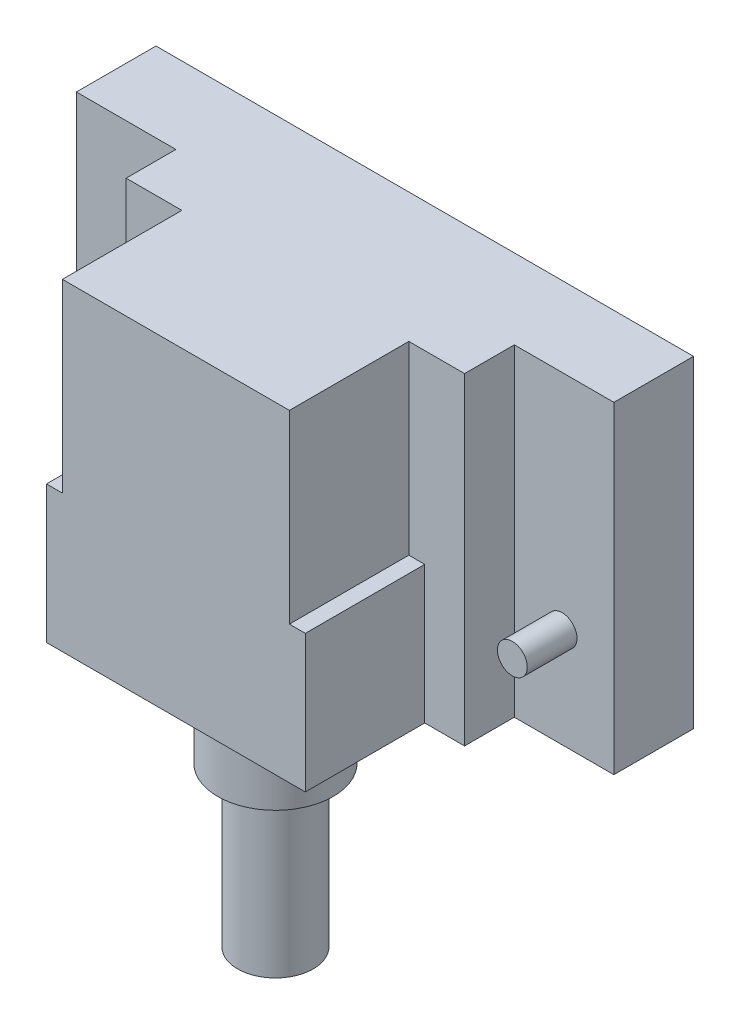
ISO-10303-21;
HEADER;
FILE_DESCRIPTION(('STEP AP214'),'2;1');
FILE_NAME('part.step','',(''),(''),'','','');
FILE_SCHEMA(('AUTOMOTIVE_DESIGN { 1 0 10303 214 1 1 1 1 }'));
ENDSEC;
DATA;
#1=APPLICATION_CONTEXT('core data for automotive mechanical design processes');
#2=APPLICATION_PROTOCOL_DEFINITION('international standard','automotive_design',2000,#1);
#3=PRODUCT_CONTEXT('',#1,'mechanical');
#4=PRODUCT('Part','Part','',(#3));
#5=PRODUCT_RELATED_PRODUCT_CATEGORY('part','',(#4));
#6=PRODUCT_DEFINITION_FORMATION('','',#4);
#7=PRODUCT_DEFINITION_CONTEXT('part definition',#1,'design');
#8=PRODUCT_DEFINITION('design','',#6,#7);
#9=PRODUCT_DEFINITION_SHAPE('','',#8);
#10=(LENGTH_UNIT() NAMED_UNIT(*) SI_UNIT(.MILLI.,.METRE.));
#11=(NAMED_UNIT(*) PLANE_ANGLE_UNIT() SI_UNIT($,.RADIAN.));
#12=(NAMED_UNIT(*) SI_UNIT($,.STERADIAN.) SOLID_ANGLE_UNIT());
#13=UNCERTAINTY_MEASURE_WITH_UNIT(LENGTH_MEASURE(1.E-05),#10,'distance_accuracy_value','');
#14=(GEOMETRIC_REPRESENTATION_CONTEXT(3) GLOBAL_UNCERTAINTY_ASSIGNED_CONTEXT((#13)) GLOBAL_UNIT_ASSIGNED_CONTEXT((#10,
#11,#12)) REPRESENTATION_CONTEXT('',''));
#15=CARTESIAN_POINT('',(0.,0.,0.));
#16=DIRECTION('',(0.,0.,1.));
#17=DIRECTION('',(1.,0.,0.));
#18=AXIS2_PLACEMENT_3D('',#15,#16,#17);
#19=CARTESIAN_POINT('',(-8.50000000000001,-8.1,-6.));
#20=DIRECTION('',(-1.,0.,0.));
#21=DIRECTION('',(0.,0.,1.));
#22=AXIS2_PLACEMENT_3D('',#19,#20,#21);
#23=PLANE('',#22);
#24=DIRECTION('',(0.,0.,-1.));
#25=VECTOR('',#24,1.);
#26=CARTESIAN_POINT('',(-8.50000000000001,8.1,-6.));
#27=LINE('',#26,#25);
#28=CARTESIAN_POINT('',(-8.50000000000001,8.1,-6.));
#29=VERTEX_POINT('',#28);
#30=CARTESIAN_POINT('',(-8.50000000000001,8.1,-8.5));
#31=VERTEX_POINT('',#30);
#32=EDGE_CURVE('E251',#29,#31,#27,.T.);
#33=ORIENTED_EDGE('',*,*,#32,.T.);
#34=DIRECTION('',(0.,-1.,0.));
#35=VECTOR('',#34,1.);
#36=CARTESIAN_POINT('',(-8.50000000000001,-8.1,-8.5));
#37=LINE('',#36,#35);
#38=CARTESIAN_POINT('',(-8.50000000000001,-8.1,-8.5));
#39=VERTEX_POINT('',#38);
#40=EDGE_CURVE('E213',#31,#39,#37,.T.);
#41=ORIENTED_EDGE('',*,*,#40,.T.);
#42=DIRECTION('',(0.,0.,-1.));
#43=VECTOR('',#42,1.);
#44=CARTESIAN_POINT('',(-8.50000000000001,-8.1,-6.));
#45=LINE('',#44,#43);
#46=CARTESIAN_POINT('',(-8.50000000000001,-8.1,-6.));
#47=VERTEX_POINT('',#46);
#48=EDGE_CURVE('E254',#47,#39,#45,.T.);
#49=ORIENTED_EDGE('',*,*,#48,.F.);
#50=DIRECTION('',(0.,1.,0.));
#51=VECTOR('',#50,1.);
#52=CARTESIAN_POINT('',(-8.50000000000001,-8.1,-6.));
#53=LINE('',#52,#51);
#54=EDGE_CURVE('E261',#47,#29,#53,.T.);
#55=ORIENTED_EDGE('',*,*,#54,.T.);
#56=EDGE_LOOP('',(#33,#41,#49,#55));
#57=FACE_BOUND('',#56,.T.);
#58=ADVANCED_FACE('F38',(#57),#23,.T.);
#59=CARTESIAN_POINT('',(8.5,-8.1,-6.));
#60=DIRECTION('',(1.,0.,0.));
#61=DIRECTION('',(0.,0.,-1.));
#62=AXIS2_PLACEMENT_3D('',#59,#60,#61);
#63=PLANE('',#62);
#64=DIRECTION('',(0.,0.,-1.));
#65=VECTOR('',#64,1.);
#66=CARTESIAN_POINT('',(8.5,-8.1,-6.));
#67=LINE('',#66,#65);
#68=CARTESIAN_POINT('',(8.5,-8.1,-6.));
#69=VERTEX_POINT('',#68);
#70=CARTESIAN_POINT('',(8.5,-8.1,-8.5));
#71=VERTEX_POINT('',#70);
#72=EDGE_CURVE('E276',#69,#71,#67,.T.);
#73=ORIENTED_EDGE('',*,*,#72,.T.);
#74=DIRECTION('',(0.,1.,0.));
#75=VECTOR('',#74,1.);
#76=CARTESIAN_POINT('',(8.5,-8.1,-8.5));
#77=LINE('',#76,#75);
#78=CARTESIAN_POINT('',(8.5,8.1,-8.5));
#79=VERTEX_POINT('',#78);
#80=EDGE_CURVE('E221',#71,#79,#77,.T.);
#81=ORIENTED_EDGE('',*,*,#80,.T.);
#82=DIRECTION('',(0.,0.,-1.));
#83=VECTOR('',#82,1.);
#84=CARTESIAN_POINT('',(8.5,8.1,-6.));
#85=LINE('',#84,#83);
#86=CARTESIAN_POINT('',(8.5,8.1,-6.));
#87=VERTEX_POINT('',#86);
#88=EDGE_CURVE('E275',#87,#79,#85,.T.);
#89=ORIENTED_EDGE('',*,*,#88,.F.);
#90=DIRECTION('',(0.,-1.,0.));
#91=VECTOR('',#90,1.);
#92=CARTESIAN_POINT('',(8.5,-8.1,-6.));
#93=LINE('',#92,#91);
#94=EDGE_CURVE('E157',#87,#69,#93,.T.);
#95=ORIENTED_EDGE('',*,*,#94,.T.);
#96=EDGE_LOOP('',(#73,#81,#89,#95));
#97=FACE_BOUND('',#96,.T.);
#98=ADVANCED_FACE('F335',(#97),#63,.T.);
#99=CARTESIAN_POINT('',(-6.50000000000001,-8.1,-12.5));
#100=DIRECTION('',(-1.,0.,0.));
#101=DIRECTION('',(0.,0.,1.));
#102=AXIS2_PLACEMENT_3D('',#99,#100,#101);
#103=PLANE('',#102);
#104=DIRECTION('',(0.,0.,1.));
#105=VECTOR('',#104,1.);
#106=CARTESIAN_POINT('',(-6.50000000000001,-1.2,-15.3343451832466));
#107=LINE('',#106,#105);
#108=CARTESIAN_POINT('',(-6.50000000000001,-1.2,-6.));
#109=VERTEX_POINT('',#108);
#110=CARTESIAN_POINT('',(-6.50000000000001,-1.2,0.));
#111=VERTEX_POINT('',#110);
#112=EDGE_CURVE('E183',#109,#111,#107,.T.);
#113=ORIENTED_EDGE('',*,*,#112,.F.);
#114=DIRECTION('',(0.,-1.,0.));
#115=VECTOR('',#114,1.);
#116=CARTESIAN_POINT('',(-6.50000000000001,-8.1,-6.));
#117=LINE('',#116,#115);
#118=CARTESIAN_POINT('',(-6.50000000000001,-8.1,-6.));
#119=VERTEX_POINT('',#118);
#120=EDGE_CURVE('E267',#109,#119,#117,.T.);
#121=ORIENTED_EDGE('',*,*,#120,.T.);
#122=DIRECTION('',(0.,0.,1.));
#123=VECTOR('',#122,1.);
#124=CARTESIAN_POINT('',(-6.50000000000001,-8.1,-12.5));
#125=LINE('',#124,#123);
#126=CARTESIAN_POINT('',(-6.50000000000001,-8.1,0.));
#127=VERTEX_POINT('',#126);
#128=EDGE_CURVE('E286',#119,#127,#125,.T.);
#129=ORIENTED_EDGE('',*,*,#128,.T.);
#130=DIRECTION('',(0.,-1.,0.));
#131=VECTOR('',#130,1.);
#132=CARTESIAN_POINT('',(-6.50000000000001,-8.1,0.));
#133=LINE('',#132,#131);
#134=EDGE_CURVE('E290',#111,#127,#133,.T.);
#135=ORIENTED_EDGE('',*,*,#134,.F.);
#136=EDGE_LOOP('',(#113,#121,#129,#135));
#137=FACE_BOUND('',#136,.T.);
#138=ADVANCED_FACE('F300',(#137),#103,.T.);
#139=CARTESIAN_POINT('',(6.5,-8.1,-12.5));
#140=DIRECTION('',(1.,0.,0.));
#141=DIRECTION('',(0.,0.,-1.));
#142=AXIS2_PLACEMENT_3D('',#139,#140,#141);
#143=PLANE('',#142);
#144=DIRECTION('',(0.,0.,1.));
#145=VECTOR('',#144,1.);
#146=CARTESIAN_POINT('',(6.5,-1.19999999999999,-15.3343451832466));
#147=LINE('',#146,#145);
#148=CARTESIAN_POINT('',(6.5,-1.19999999999999,-6.));
#149=VERTEX_POINT('',#148);
#150=CARTESIAN_POINT('',(6.5,-1.19999999999999,0.));
#151=VERTEX_POINT('',#150);
#152=EDGE_CURVE('E208',#149,#151,#147,.T.);
#153=ORIENTED_EDGE('',*,*,#152,.T.);
#154=DIRECTION('',(0.,1.,0.));
#155=VECTOR('',#154,1.);
#156=CARTESIAN_POINT('',(6.5,-8.1,0.));
#157=LINE('',#156,#155);
#158=CARTESIAN_POINT('',(6.5,-8.1,0.));
#159=VERTEX_POINT('',#158);
#160=EDGE_CURVE('E279',#159,#151,#157,.T.);
#161=ORIENTED_EDGE('',*,*,#160,.F.);
#162=DIRECTION('',(0.,0.,1.));
#163=VECTOR('',#162,1.);
#164=CARTESIAN_POINT('',(6.5,-8.1,-12.5));
#165=LINE('',#164,#163);
#166=CARTESIAN_POINT('',(6.5,-8.1,-6.));
#167=VERTEX_POINT('',#166);
#168=EDGE_CURVE('E247',#167,#159,#165,.T.);
#169=ORIENTED_EDGE('',*,*,#168,.F.);
#170=DIRECTION('',(0.,1.,0.));
#171=VECTOR('',#170,1.);
#172=CARTESIAN_POINT('',(6.5,-8.1,-6.));
#173=LINE('',#172,#171);
#174=EDGE_CURVE('E161',#167,#149,#173,.T.);
#175=ORIENTED_EDGE('',*,*,#174,.T.);
#176=EDGE_LOOP('',(#153,#161,#169,#175));
#177=FACE_BOUND('',#176,.T.);
#178=ADVANCED_FACE('F40',(#177),#143,.T.);
#179=CARTESIAN_POINT('',(-6.50000000000001,-8.1,-12.5));
#180=DIRECTION('',(0.,-1.,0.));
#181=DIRECTION('',(0.,0.,-1.));
#182=AXIS2_PLACEMENT_3D('',#179,#180,#181);
#183=PLANE('',#182);
#184=CARTESIAN_POINT('',(2.,-8.1,-3.));
#185=DIRECTION('',(0.,-1.,0.));
#186=DIRECTION('',(0.,0.,-1.));
#187=AXIS2_PLACEMENT_3D('',#184,#185,#186);
#188=CIRCLE('',#187,2.9);
#189=CARTESIAN_POINT('',(2.,-8.1,-5.9));
#190=VERTEX_POINT('',#189);
#191=EDGE_CURVE('E244',#190,#190,#188,.T.);
#192=ORIENTED_EDGE('',*,*,#191,.F.);
#193=EDGE_LOOP('',(#192));
#194=FACE_BOUND('',#193,.T.);
#195=DIRECTION('',(1.,0.,0.));
#196=VECTOR('',#195,1.);
#197=CARTESIAN_POINT('',(-6.50000000000001,-8.1,0.));
#198=LINE('',#197,#196);
#199=EDGE_CURVE('E284',#127,#159,#198,.T.);
#200=ORIENTED_EDGE('',*,*,#199,.F.);
#201=ORIENTED_EDGE('',*,*,#128,.F.);
#202=DIRECTION('',(-1.,0.,0.));
#203=VECTOR('',#202,1.);
#204=CARTESIAN_POINT('',(-6.50000000000001,-8.1,-6.));
#205=LINE('',#204,#203);
#206=EDGE_CURVE('E264',#119,#47,#205,.T.);
#207=ORIENTED_EDGE('',*,*,#206,.T.);
#208=ORIENTED_EDGE('',*,*,#48,.T.);
#209=DIRECTION('',(-1.,0.,0.));
#210=VECTOR('',#209,1.);
#211=CARTESIAN_POINT('',(-8.50000000000001,-8.1,-8.5));
#212=LINE('',#211,#210);
#213=CARTESIAN_POINT('',(-13.5,-8.1,-8.5));
#214=VERTEX_POINT('',#213);
#215=EDGE_CURVE('E61',#39,#214,#212,.T.);
#216=ORIENTED_EDGE('',*,*,#215,.T.);
#217=DIRECTION('',(0.,0.,-1.));
#218=VECTOR('',#217,1.);
#219=CARTESIAN_POINT('',(-13.5,-8.1,-8.5));
#220=LINE('',#219,#218);
#221=CARTESIAN_POINT('',(-13.5,-8.1,-12.5));
#222=VERTEX_POINT('',#221);
#223=EDGE_CURVE('E201',#214,#222,#220,.T.);
#224=ORIENTED_EDGE('',*,*,#223,.T.);
#225=DIRECTION('',(1.,0.,0.));
#226=VECTOR('',#225,1.);
#227=CARTESIAN_POINT('',(-6.50000000000001,-8.1,-12.5));
#228=LINE('',#227,#226);
#229=CARTESIAN_POINT('',(13.5,-8.1,-12.5));
#230=VERTEX_POINT('',#229);
#231=EDGE_CURVE('E283',#222,#230,#228,.T.);
#232=ORIENTED_EDGE('',*,*,#231,.T.);
#233=DIRECTION('',(0.,0.,-1.));
#234=VECTOR('',#233,1.);
#235=CARTESIAN_POINT('',(13.5,-8.1,-8.5));
#236=LINE('',#235,#234);
#237=CARTESIAN_POINT('',(13.5,-8.1,-8.5));
#238=VERTEX_POINT('',#237);
#239=EDGE_CURVE('E236',#238,#230,#236,.T.);
#240=ORIENTED_EDGE('',*,*,#239,.F.);
#241=DIRECTION('',(-1.,0.,0.));
#242=VECTOR('',#241,1.);
#243=CARTESIAN_POINT('',(8.5,-8.1,-8.5));
#244=LINE('',#243,#242);
#245=EDGE_CURVE('E230',#238,#71,#244,.T.);
#246=ORIENTED_EDGE('',*,*,#245,.T.);
#247=ORIENTED_EDGE('',*,*,#72,.F.);
#248=DIRECTION('',(-1.,0.,0.));
#249=VECTOR('',#248,1.);
#250=CARTESIAN_POINT('',(6.5,-8.1,-6.));
#251=LINE('',#250,#249);
#252=EDGE_CURVE('E272',#69,#167,#251,.T.);
#253=ORIENTED_EDGE('',*,*,#252,.T.);
#254=ORIENTED_EDGE('',*,*,#168,.T.);
#255=EDGE_LOOP('',(#200,#201,#207,#208,#216,#224,#232,#240,#246,#247,#253,#254));
#256=FACE_BOUND('',#255,.T.);
#257=ADVANCED_FACE('F304',(#194,#256),#183,.T.);
#258=CARTESIAN_POINT('',(-6.50000000000001,8.1,-12.5));
#259=DIRECTION('',(0.,1.,0.));
#260=DIRECTION('',(0.,0.,1.));
#261=AXIS2_PLACEMENT_3D('',#258,#259,#260);
#262=PLANE('',#261);
#263=DIRECTION('',(0.,0.,1.));
#264=VECTOR('',#263,1.);
#265=CARTESIAN_POINT('',(5.7,8.1,-15.3343451832466));
#266=LINE('',#265,#264);
#267=CARTESIAN_POINT('',(5.7,8.1,-6.));
#268=VERTEX_POINT('',#267);
#269=CARTESIAN_POINT('',(5.7,8.1,0.));
#270=VERTEX_POINT('',#269);
#271=EDGE_CURVE('E167',#268,#270,#266,.T.);
#272=ORIENTED_EDGE('',*,*,#271,.F.);
#273=DIRECTION('',(1.,0.,0.));
#274=VECTOR('',#273,1.);
#275=CARTESIAN_POINT('',(6.5,8.1,-6.));
#276=LINE('',#275,#274);
#277=EDGE_CURVE('E151',#268,#87,#276,.T.);
#278=ORIENTED_EDGE('',*,*,#277,.T.);
#279=ORIENTED_EDGE('',*,*,#88,.T.);
#280=DIRECTION('',(1.,0.,0.));
#281=VECTOR('',#280,1.);
#282=CARTESIAN_POINT('',(8.5,8.1,-8.5));
#283=LINE('',#282,#281);
#284=CARTESIAN_POINT('',(13.5,8.1,-8.5));
#285=VERTEX_POINT('',#284);
#286=EDGE_CURVE('E224',#79,#285,#283,.T.);
#287=ORIENTED_EDGE('',*,*,#286,.T.);
#288=DIRECTION('',(0.,0.,-1.));
#289=VECTOR('',#288,1.);
#290=CARTESIAN_POINT('',(13.5,8.1,-8.5));
#291=LINE('',#290,#289);
#292=CARTESIAN_POINT('',(13.5,8.1,-12.5));
#293=VERTEX_POINT('',#292);
#294=EDGE_CURVE('E233',#285,#293,#291,.T.);
#295=ORIENTED_EDGE('',*,*,#294,.T.);
#296=DIRECTION('',(-1.,0.,0.));
#297=VECTOR('',#296,1.);
#298=CARTESIAN_POINT('',(-6.50000000000001,8.1,-12.5));
#299=LINE('',#298,#297);
#300=CARTESIAN_POINT('',(-13.5,8.1,-12.5));
#301=VERTEX_POINT('',#300);
#302=EDGE_CURVE('E281',#293,#301,#299,.T.);
#303=ORIENTED_EDGE('',*,*,#302,.T.);
#304=DIRECTION('',(0.,0.,-1.));
#305=VECTOR('',#304,1.);
#306=CARTESIAN_POINT('',(-13.5,8.1,-8.5));
#307=LINE('',#306,#305);
#308=CARTESIAN_POINT('',(-13.5,8.1,-8.5));
#309=VERTEX_POINT('',#308);
#310=EDGE_CURVE('E205',#309,#301,#307,.T.);
#311=ORIENTED_EDGE('',*,*,#310,.F.);
#312=DIRECTION('',(1.,0.,0.));
#313=VECTOR('',#312,1.);
#314=CARTESIAN_POINT('',(-8.50000000000001,8.1,-8.5));
#315=LINE('',#314,#313);
#316=EDGE_CURVE('E204',#309,#31,#315,.T.);
#317=ORIENTED_EDGE('',*,*,#316,.T.);
#318=ORIENTED_EDGE('',*,*,#32,.F.);
#319=DIRECTION('',(1.,0.,0.));
#320=VECTOR('',#319,1.);
#321=CARTESIAN_POINT('',(-6.50000000000001,8.1,-6.));
#322=LINE('',#321,#320);
#323=CARTESIAN_POINT('',(-5.70000000000001,8.1,-6.));
#324=VERTEX_POINT('',#323);
#325=EDGE_CURVE('E257',#29,#324,#322,.T.);
#326=ORIENTED_EDGE('',*,*,#325,.T.);
#327=DIRECTION('',(0.,0.,1.));
#328=VECTOR('',#327,1.);
#329=CARTESIAN_POINT('',(-5.70000000000001,8.1,-15.3343451832466));
#330=LINE('',#329,#328);
#331=CARTESIAN_POINT('',(-5.70000000000001,8.1,0.));
#332=VERTEX_POINT('',#331);
#333=EDGE_CURVE('E185',#324,#332,#330,.T.);
#334=ORIENTED_EDGE('',*,*,#333,.T.);
#335=DIRECTION('',(-1.,0.,0.));
#336=VECTOR('',#335,1.);
#337=CARTESIAN_POINT('',(-6.50000000000001,8.1,0.));
#338=LINE('',#337,#336);
#339=EDGE_CURVE('E175',#270,#332,#338,.T.);
#340=ORIENTED_EDGE('',*,*,#339,.F.);
#341=EDGE_LOOP('',(#272,#278,#279,#287,#295,#303,#311,#317,#318,#326,#334,#340));
#342=FACE_BOUND('',#341,.T.);
#343=ADVANCED_FACE('F172',(#342),#262,.T.);
#344=CARTESIAN_POINT('',(0.,0.,-12.5));
#345=DIRECTION('',(0.,0.,-1.));
#346=DIRECTION('',(-1.,0.,0.));
#347=AXIS2_PLACEMENT_3D('',#344,#345,#346);
#348=PLANE('',#347);
#349=ORIENTED_EDGE('',*,*,#302,.F.);
#350=DIRECTION('',(0.,-1.,0.));
#351=VECTOR('',#350,1.);
#352=CARTESIAN_POINT('',(13.5,-8.1,-12.5));
#353=LINE('',#352,#351);
#354=EDGE_CURVE('E212',#293,#230,#353,.T.);
#355=ORIENTED_EDGE('',*,*,#354,.T.);
#356=ORIENTED_EDGE('',*,*,#231,.F.);
#357=DIRECTION('',(0.,1.,0.));
#358=VECTOR('',#357,1.);
#359=CARTESIAN_POINT('',(-13.5,-8.1,-12.5));
#360=LINE('',#359,#358);
#361=EDGE_CURVE('E209',#222,#301,#360,.T.);
#362=ORIENTED_EDGE('',*,*,#361,.T.);
#363=EDGE_LOOP('',(#349,#355,#356,#362));
#364=FACE_BOUND('',#363,.T.);
#365=ADVANCED_FACE('F331',(#364),#348,.T.);
#366=CARTESIAN_POINT('',(0.,0.,0.));
#367=DIRECTION('',(0.,0.,-1.));
#368=DIRECTION('',(-1.,0.,0.));
#369=AXIS2_PLACEMENT_3D('',#366,#367,#368);
#370=PLANE('',#369);
#371=DIRECTION('',(1.,0.,0.));
#372=VECTOR('',#371,1.);
#373=CARTESIAN_POINT('',(6.5,-1.19999999999999,0.));
#374=LINE('',#373,#372);
#375=CARTESIAN_POINT('',(5.7,-1.2,0.));
#376=VERTEX_POINT('',#375);
#377=EDGE_CURVE('E176',#376,#151,#374,.T.);
#378=ORIENTED_EDGE('',*,*,#377,.F.);
#379=DIRECTION('',(0.,-1.,0.));
#380=VECTOR('',#379,1.);
#381=CARTESIAN_POINT('',(5.7,8.1,0.));
#382=LINE('',#381,#380);
#383=EDGE_CURVE('E178',#270,#376,#382,.T.);
#384=ORIENTED_EDGE('',*,*,#383,.F.);
#385=ORIENTED_EDGE('',*,*,#339,.T.);
#386=DIRECTION('',(0.,1.,0.));
#387=VECTOR('',#386,1.);
#388=CARTESIAN_POINT('',(-5.70000000000001,8.1,0.));
#389=LINE('',#388,#387);
#390=CARTESIAN_POINT('',(-5.70000000000001,-1.2,0.));
#391=VERTEX_POINT('',#390);
#392=EDGE_CURVE('E196',#391,#332,#389,.T.);
#393=ORIENTED_EDGE('',*,*,#392,.F.);
#394=DIRECTION('',(1.,0.,0.));
#395=VECTOR('',#394,1.);
#396=CARTESIAN_POINT('',(-6.50000000000001,-1.2,0.));
#397=LINE('',#396,#395);
#398=EDGE_CURVE('E197',#111,#391,#397,.T.);
#399=ORIENTED_EDGE('',*,*,#398,.F.);
#400=ORIENTED_EDGE('',*,*,#134,.T.);
#401=ORIENTED_EDGE('',*,*,#199,.T.);
#402=ORIENTED_EDGE('',*,*,#160,.T.);
#403=EDGE_LOOP('',(#378,#384,#385,#393,#399,#400,#401,#402));
#404=FACE_BOUND('',#403,.T.);
#405=ADVANCED_FACE('F309',(#404),#370,.F.);
#406=CARTESIAN_POINT('',(0.,0.,-6.));
#407=DIRECTION('',(0.,0.,-1.));
#408=DIRECTION('',(-1.,0.,0.));
#409=AXIS2_PLACEMENT_3D('',#406,#407,#408);
#410=PLANE('',#409);
#411=ORIENTED_EDGE('',*,*,#174,.F.);
#412=ORIENTED_EDGE('',*,*,#252,.F.);
#413=ORIENTED_EDGE('',*,*,#94,.F.);
#414=ORIENTED_EDGE('',*,*,#277,.F.);
#415=DIRECTION('',(0.,-1.,0.));
#416=VECTOR('',#415,1.);
#417=CARTESIAN_POINT('',(5.7,8.1,-6.));
#418=LINE('',#417,#416);
#419=CARTESIAN_POINT('',(5.7,-1.19999999999999,-6.));
#420=VERTEX_POINT('',#419);
#421=EDGE_CURVE('E154',#268,#420,#418,.T.);
#422=ORIENTED_EDGE('',*,*,#421,.T.);
#423=DIRECTION('',(1.,0.,0.));
#424=VECTOR('',#423,1.);
#425=CARTESIAN_POINT('',(6.5,-1.19999999999999,-6.));
#426=LINE('',#425,#424);
#427=EDGE_CURVE('E53',#420,#149,#426,.T.);
#428=ORIENTED_EDGE('',*,*,#427,.T.);
#429=EDGE_LOOP('',(#411,#412,#413,#414,#422,#428));
#430=FACE_BOUND('',#429,.T.);
#431=ADVANCED_FACE('F153',(#430),#410,.F.);
#432=CARTESIAN_POINT('',(0.,0.,-6.));
#433=DIRECTION('',(0.,0.,1.));
#434=DIRECTION('',(1.,0.,0.));
#435=AXIS2_PLACEMENT_3D('',#432,#433,#434);
#436=PLANE('',#435);
#437=ORIENTED_EDGE('',*,*,#120,.F.);
#438=DIRECTION('',(1.,0.,0.));
#439=VECTOR('',#438,1.);
#440=CARTESIAN_POINT('',(-6.50000000000001,-1.2,-6.));
#441=LINE('',#440,#439);
#442=CARTESIAN_POINT('',(-5.70000000000001,-1.2,-6.));
#443=VERTEX_POINT('',#442);
#444=EDGE_CURVE('E189',#109,#443,#441,.T.);
#445=ORIENTED_EDGE('',*,*,#444,.T.);
#446=DIRECTION('',(0.,1.,0.));
#447=VECTOR('',#446,1.);
#448=CARTESIAN_POINT('',(-5.70000000000001,8.1,-6.));
#449=LINE('',#448,#447);
#450=EDGE_CURVE('E190',#443,#324,#449,.T.);
#451=ORIENTED_EDGE('',*,*,#450,.T.);
#452=ORIENTED_EDGE('',*,*,#325,.F.);
#453=ORIENTED_EDGE('',*,*,#54,.F.);
#454=ORIENTED_EDGE('',*,*,#206,.F.);
#455=EDGE_LOOP('',(#437,#445,#451,#452,#453,#454));
#456=FACE_BOUND('',#455,.T.);
#457=ADVANCED_FACE('F316',(#456),#436,.T.);
#458=CARTESIAN_POINT('',(2.,-10.6,-3.));
#459=DIRECTION('',(0.,1.,0.));
#460=DIRECTION('',(0.,0.,1.));
#461=AXIS2_PLACEMENT_3D('',#458,#459,#460);
#462=CYLINDRICAL_SURFACE('',#461,2.9);
#463=CARTESIAN_POINT('',(2.,-10.6,-3.));
#464=DIRECTION('',(0.,-1.,0.));
#465=DIRECTION('',(0.,0.,-1.));
#466=AXIS2_PLACEMENT_3D('',#463,#464,#465);
#467=CIRCLE('',#466,2.9);
#468=CARTESIAN_POINT('',(2.,-10.6,-5.9));
#469=VERTEX_POINT('',#468);
#470=EDGE_CURVE('E248',#469,#469,#467,.T.);
#471=ORIENTED_EDGE('',*,*,#470,.F.);
#472=EDGE_LOOP('',(#471));
#473=FACE_BOUND('',#472,.T.);
#474=ORIENTED_EDGE('',*,*,#191,.T.);
#475=EDGE_LOOP('',(#474));
#476=FACE_BOUND('',#475,.T.);
#477=ADVANCED_FACE('F375',(#473,#476),#462,.T.);
#478=CARTESIAN_POINT('',(2.,-10.6,-3.));
#479=DIRECTION('',(0.,-1.,0.));
#480=DIRECTION('',(0.,0.,-1.));
#481=AXIS2_PLACEMENT_3D('',#478,#479,#480);
#482=PLANE('',#481);
#483=CARTESIAN_POINT('',(2.,-10.6,-3.));
#484=DIRECTION('',(0.,-1.,0.));
#485=DIRECTION('',(0.,0.,-1.));
#486=AXIS2_PLACEMENT_3D('',#483,#484,#485);
#487=CIRCLE('',#486,1.9);
#488=CARTESIAN_POINT('',(2.,-10.6,-4.9));
#489=VERTEX_POINT('',#488);
#490=EDGE_CURVE('E46',#489,#489,#487,.T.);
#491=ORIENTED_EDGE('',*,*,#490,.F.);
#492=EDGE_LOOP('',(#491));
#493=FACE_BOUND('',#492,.T.);
#494=ORIENTED_EDGE('',*,*,#470,.T.);
#495=EDGE_LOOP('',(#494));
#496=FACE_BOUND('',#495,.T.);
#497=ADVANCED_FACE('F420',(#493,#496),#482,.T.);
#498=CARTESIAN_POINT('',(2.,-18.6,-3.));
#499=DIRECTION('',(0.,1.,0.));
#500=DIRECTION('',(0.,0.,1.));
#501=AXIS2_PLACEMENT_3D('',#498,#499,#500);
#502=CYLINDRICAL_SURFACE('',#501,1.9);
#503=CARTESIAN_POINT('',(2.,-18.6,-3.));
#504=DIRECTION('',(0.,-1.,0.));
#505=DIRECTION('',(0.,0.,-1.));
#506=AXIS2_PLACEMENT_3D('',#503,#504,#505);
#507=CIRCLE('',#506,1.9);
#508=CARTESIAN_POINT('',(2.,-18.6,-4.9));
#509=VERTEX_POINT('',#508);
#510=EDGE_CURVE('E239',#509,#509,#507,.T.);
#511=ORIENTED_EDGE('',*,*,#510,.F.);
#512=EDGE_LOOP('',(#511));
#513=FACE_BOUND('',#512,.T.);
#514=ORIENTED_EDGE('',*,*,#490,.T.);
#515=EDGE_LOOP('',(#514));
#516=FACE_BOUND('',#515,.T.);
#517=ADVANCED_FACE('F427',(#513,#516),#502,.T.);
#518=CARTESIAN_POINT('',(2.,-18.6,-3.));
#519=DIRECTION('',(0.,-1.,0.));
#520=DIRECTION('',(0.,0.,-1.));
#521=AXIS2_PLACEMENT_3D('',#518,#519,#520);
#522=PLANE('',#521);
#523=ORIENTED_EDGE('',*,*,#510,.T.);
#524=EDGE_LOOP('',(#523));
#525=FACE_BOUND('',#524,.T.);
#526=ADVANCED_FACE('F434',(#525),#522,.T.);
#527=CARTESIAN_POINT('',(13.5,-8.1,-8.5));
#528=DIRECTION('',(1.,0.,0.));
#529=DIRECTION('',(0.,0.,-1.));
#530=AXIS2_PLACEMENT_3D('',#527,#528,#529);
#531=PLANE('',#530);
#532=ORIENTED_EDGE('',*,*,#354,.F.);
#533=ORIENTED_EDGE('',*,*,#294,.F.);
#534=DIRECTION('',(0.,-1.,0.));
#535=VECTOR('',#534,1.);
#536=CARTESIAN_POINT('',(13.5,-8.1,-8.5));
#537=LINE('',#536,#535);
#538=EDGE_CURVE('E227',#285,#238,#537,.T.);
#539=ORIENTED_EDGE('',*,*,#538,.T.);
#540=ORIENTED_EDGE('',*,*,#239,.T.);
#541=EDGE_LOOP('',(#532,#533,#539,#540));
#542=FACE_BOUND('',#541,.T.);
#543=ADVANCED_FACE('F328',(#542),#531,.T.);
#544=CARTESIAN_POINT('',(0.,0.,-8.5));
#545=DIRECTION('',(0.,0.,-1.));
#546=DIRECTION('',(-1.,0.,0.));
#547=AXIS2_PLACEMENT_3D('',#544,#545,#546);
#548=PLANE('',#547);
#549=CARTESIAN_POINT('',(10.9,-3.1,-8.5));
#550=DIRECTION('',(0.,0.,-1.));
#551=DIRECTION('',(-1.,0.,0.));
#552=AXIS2_PLACEMENT_3D('',#549,#550,#551);
#553=CIRCLE('',#552,0.75);
#554=CARTESIAN_POINT('',(10.15,-3.1,-8.5));
#555=VERTEX_POINT('',#554);
#556=EDGE_CURVE('E11',#555,#555,#553,.F.);
#557=ORIENTED_EDGE('',*,*,#556,.F.);
#558=EDGE_LOOP('',(#557));
#559=FACE_BOUND('',#558,.T.);
#560=ORIENTED_EDGE('',*,*,#80,.F.);
#561=ORIENTED_EDGE('',*,*,#245,.F.);
#562=ORIENTED_EDGE('',*,*,#538,.F.);
#563=ORIENTED_EDGE('',*,*,#286,.F.);
#564=EDGE_LOOP('',(#560,#561,#562,#563));
#565=FACE_BOUND('',#564,.T.);
#566=ADVANCED_FACE('F333',(#559,#565),#548,.F.);
#567=CARTESIAN_POINT('',(-13.5,-8.1,-8.5));
#568=DIRECTION('',(-1.,0.,0.));
#569=DIRECTION('',(0.,0.,1.));
#570=AXIS2_PLACEMENT_3D('',#567,#568,#569);
#571=PLANE('',#570);
#572=ORIENTED_EDGE('',*,*,#361,.F.);
#573=ORIENTED_EDGE('',*,*,#223,.F.);
#574=DIRECTION('',(0.,1.,0.));
#575=VECTOR('',#574,1.);
#576=CARTESIAN_POINT('',(-13.5,-8.1,-8.5));
#577=LINE('',#576,#575);
#578=EDGE_CURVE('E216',#214,#309,#577,.T.);
#579=ORIENTED_EDGE('',*,*,#578,.T.);
#580=ORIENTED_EDGE('',*,*,#310,.T.);
#581=EDGE_LOOP('',(#572,#573,#579,#580));
#582=FACE_BOUND('',#581,.T.);
#583=ADVANCED_FACE('F324',(#582),#571,.T.);
#584=CARTESIAN_POINT('',(0.,0.,-8.5));
#585=DIRECTION('',(0.,0.,1.));
#586=DIRECTION('',(1.,0.,0.));
#587=AXIS2_PLACEMENT_3D('',#584,#585,#586);
#588=PLANE('',#587);
#589=CARTESIAN_POINT('',(-10.9,-3.1,-8.5));
#590=DIRECTION('',(0.,0.,1.));
#591=DIRECTION('',(1.,0.,0.));
#592=AXIS2_PLACEMENT_3D('',#589,#590,#591);
#593=CIRCLE('',#592,0.75);
#594=CARTESIAN_POINT('',(-10.15,-3.1,-8.5));
#595=VERTEX_POINT('',#594);
#596=EDGE_CURVE('E344',#595,#595,#593,.T.);
#597=ORIENTED_EDGE('',*,*,#596,.F.);
#598=EDGE_LOOP('',(#597));
#599=FACE_BOUND('',#598,.T.);
#600=ORIENTED_EDGE('',*,*,#40,.F.);
#601=ORIENTED_EDGE('',*,*,#316,.F.);
#602=ORIENTED_EDGE('',*,*,#578,.F.);
#603=ORIENTED_EDGE('',*,*,#215,.F.);
#604=EDGE_LOOP('',(#600,#601,#602,#603));
#605=FACE_BOUND('',#604,.T.);
#606=ADVANCED_FACE('F321',(#599,#605),#588,.T.);
#607=CARTESIAN_POINT('',(-6.50000000000001,-1.2,-15.3343451832466));
#608=DIRECTION('',(0.,-1.,0.));
#609=DIRECTION('',(0.,0.,-1.));
#610=AXIS2_PLACEMENT_3D('',#607,#608,#609);
#611=PLANE('',#610);
#612=ORIENTED_EDGE('',*,*,#112,.T.);
#613=ORIENTED_EDGE('',*,*,#398,.T.);
#614=DIRECTION('',(0.,0.,1.));
#615=VECTOR('',#614,1.);
#616=CARTESIAN_POINT('',(-5.70000000000001,-1.2,-15.3343451832466));
#617=LINE('',#616,#615);
#618=EDGE_CURVE('E187',#443,#391,#617,.T.);
#619=ORIENTED_EDGE('',*,*,#618,.F.);
#620=ORIENTED_EDGE('',*,*,#444,.F.);
#621=EDGE_LOOP('',(#612,#613,#619,#620));
#622=FACE_BOUND('',#621,.T.);
#623=ADVANCED_FACE('F314',(#622),#611,.F.);
#624=CARTESIAN_POINT('',(-5.70000000000001,8.1,-15.3343451832466));
#625=DIRECTION('',(1.,0.,0.));
#626=DIRECTION('',(0.,1.,0.));
#627=AXIS2_PLACEMENT_3D('',#624,#625,#626);
#628=PLANE('',#627);
#629=ORIENTED_EDGE('',*,*,#618,.T.);
#630=ORIENTED_EDGE('',*,*,#392,.T.);
#631=ORIENTED_EDGE('',*,*,#333,.F.);
#632=ORIENTED_EDGE('',*,*,#450,.F.);
#633=EDGE_LOOP('',(#629,#630,#631,#632));
#634=FACE_BOUND('',#633,.T.);
#635=ADVANCED_FACE('F476',(#634),#628,.F.);
#636=CARTESIAN_POINT('',(5.7,8.1,-15.3343451832466));
#637=DIRECTION('',(-1.,0.,0.));
#638=DIRECTION('',(0.,-1.,0.));
#639=AXIS2_PLACEMENT_3D('',#636,#637,#638);
#640=PLANE('',#639);
#641=ORIENTED_EDGE('',*,*,#271,.T.);
#642=ORIENTED_EDGE('',*,*,#383,.T.);
#643=DIRECTION('',(0.,0.,1.));
#644=VECTOR('',#643,1.);
#645=CARTESIAN_POINT('',(5.7,-1.2,-15.3343451832466));
#646=LINE('',#645,#644);
#647=EDGE_CURVE('E169',#420,#376,#646,.T.);
#648=ORIENTED_EDGE('',*,*,#647,.F.);
#649=ORIENTED_EDGE('',*,*,#421,.F.);
#650=EDGE_LOOP('',(#641,#642,#648,#649));
#651=FACE_BOUND('',#650,.T.);
#652=ADVANCED_FACE('F165',(#651),#640,.F.);
#653=CARTESIAN_POINT('',(6.5,-1.19999999999999,-15.3343451832466));
#654=DIRECTION('',(0.,-1.,0.));
#655=DIRECTION('',(1.,0.,0.));
#656=AXIS2_PLACEMENT_3D('',#653,#654,#655);
#657=PLANE('',#656);
#658=ORIENTED_EDGE('',*,*,#647,.T.);
#659=ORIENTED_EDGE('',*,*,#377,.T.);
#660=ORIENTED_EDGE('',*,*,#152,.F.);
#661=ORIENTED_EDGE('',*,*,#427,.F.);
#662=EDGE_LOOP('',(#658,#659,#660,#661));
#663=FACE_BOUND('',#662,.T.);
#664=ADVANCED_FACE('F490',(#663),#657,.F.);
#665=CARTESIAN_POINT('',(-10.9,-3.1,-3.87867965644036));
#666=DIRECTION('',(0.,0.,-1.));
#667=DIRECTION('',(-1.,0.,0.));
#668=AXIS2_PLACEMENT_3D('',#665,#666,#667);
#669=CYLINDRICAL_SURFACE('',#668,0.75);
#670=ORIENTED_EDGE('',*,*,#596,.T.);
#671=EDGE_LOOP('',(#670));
#672=FACE_BOUND('',#671,.T.);
#673=CARTESIAN_POINT('',(-10.9,-3.1,-6.));
#674=DIRECTION('',(0.,0.,1.));
#675=DIRECTION('',(1.,0.,0.));
#676=AXIS2_PLACEMENT_3D('',#673,#674,#675);
#677=CIRCLE('',#676,0.75);
#678=CARTESIAN_POINT('',(-10.15,-3.1,-6.));
#679=VERTEX_POINT('',#678);
#680=EDGE_CURVE('E186',#679,#679,#677,.T.);
#681=ORIENTED_EDGE('',*,*,#680,.F.);
#682=EDGE_LOOP('',(#681));
#683=FACE_BOUND('',#682,.T.);
#684=ADVANCED_FACE('F363',(#672,#683),#669,.T.);
#685=CARTESIAN_POINT('',(0.,0.,-6.));
#686=DIRECTION('',(0.,0.,1.));
#687=DIRECTION('',(1.,0.,0.));
#688=AXIS2_PLACEMENT_3D('',#685,#686,#687);
#689=PLANE('',#688);
#690=ORIENTED_EDGE('',*,*,#680,.T.);
#691=EDGE_LOOP('',(#690));
#692=FACE_BOUND('',#691,.T.);
#693=ADVANCED_FACE('F355',(#692),#689,.T.);
#694=CARTESIAN_POINT('',(10.9,-3.1,-3.87867965644036));
#695=DIRECTION('',(0.,0.,-1.));
#696=DIRECTION('',(-1.,0.,0.));
#697=AXIS2_PLACEMENT_3D('',#694,#695,#696);
#698=CYLINDRICAL_SURFACE('',#697,0.75);
#699=ORIENTED_EDGE('',*,*,#556,.T.);
#700=EDGE_LOOP('',(#699));
#701=FACE_BOUND('',#700,.T.);
#702=CARTESIAN_POINT('',(10.9,-3.1,-6.));
#703=DIRECTION('',(0.,0.,1.));
#704=DIRECTION('',(1.,0.,0.));
#705=AXIS2_PLACEMENT_3D('',#702,#703,#704);
#706=CIRCLE('',#705,0.75);
#707=CARTESIAN_POINT('',(11.65,-3.1,-6.));
#708=VERTEX_POINT('',#707);
#709=EDGE_CURVE('E347',#708,#708,#706,.T.);
#710=ORIENTED_EDGE('',*,*,#709,.F.);
#711=EDGE_LOOP('',(#710));
#712=FACE_BOUND('',#711,.T.);
#713=ADVANCED_FACE('F353',(#701,#712),#698,.T.);
#714=CARTESIAN_POINT('',(0.,0.,-6.));
#715=DIRECTION('',(0.,0.,1.));
#716=DIRECTION('',(1.,0.,0.));
#717=AXIS2_PLACEMENT_3D('',#714,#715,#716);
#718=PLANE('',#717);
#719=ORIENTED_EDGE('',*,*,#709,.T.);
#720=EDGE_LOOP('',(#719));
#721=FACE_BOUND('',#720,.T.);
#722=ADVANCED_FACE('F351',(#721),#718,.T.);
#723=CLOSED_SHELL('',(#58,#98,#138,#178,#257,#343,#365,#405,#431,#457,#477,#497,#517,#526,#543,
#566,#583,#606,#623,#635,#652,#664,#684,#693,#713,#722));
#724=MANIFOLD_SOLID_BREP('B2',#723);
#725=ADVANCED_BREP_SHAPE_REPRESENTATION('',(#18,#724),#14);
#726=SHAPE_DEFINITION_REPRESENTATION(#9,#725);
ENDSEC;
END-ISO-10303-21;
